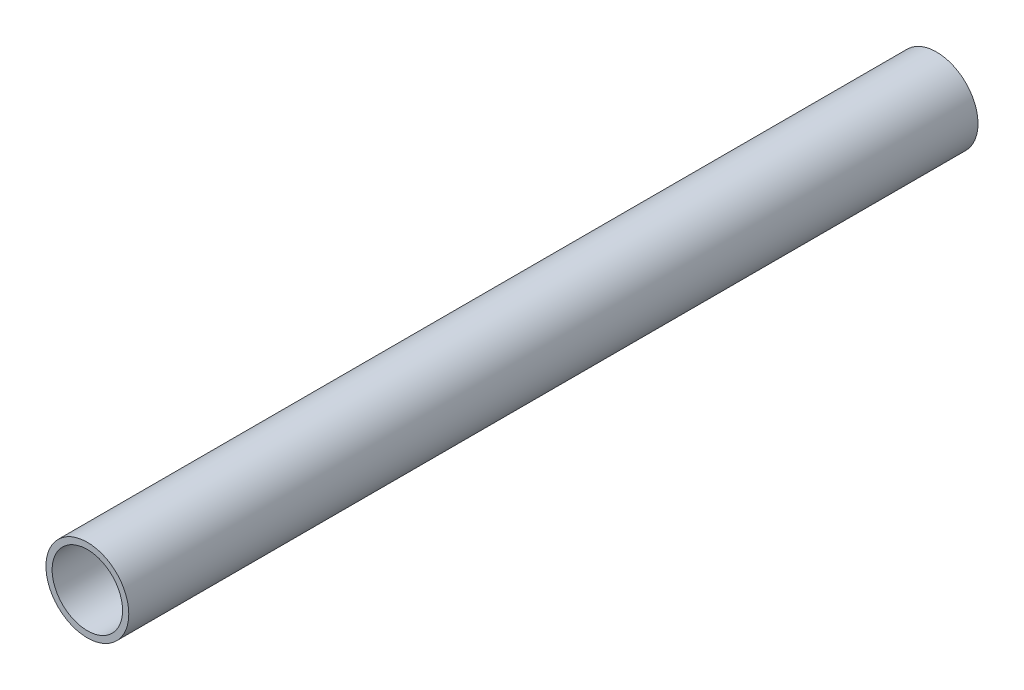
ISO-10303-21;
HEADER;
FILE_DESCRIPTION(('STEP AP214'),'2;1');
FILE_NAME('part.step','',(''),(''),'','','');
FILE_SCHEMA(('AUTOMOTIVE_DESIGN { 1 0 10303 214 1 1 1 1 }'));
ENDSEC;
DATA;
#1=APPLICATION_CONTEXT('core data for automotive mechanical design processes');
#2=APPLICATION_PROTOCOL_DEFINITION('international standard','automotive_design',2000,#1);
#3=PRODUCT_CONTEXT('',#1,'mechanical');
#4=PRODUCT('Part','Part','',(#3));
#5=PRODUCT_RELATED_PRODUCT_CATEGORY('part','',(#4));
#6=PRODUCT_DEFINITION_FORMATION('','',#4);
#7=PRODUCT_DEFINITION_CONTEXT('part definition',#1,'design');
#8=PRODUCT_DEFINITION('design','',#6,#7);
#9=PRODUCT_DEFINITION_SHAPE('','',#8);
#10=(LENGTH_UNIT() NAMED_UNIT(*) SI_UNIT(.MILLI.,.METRE.));
#11=(NAMED_UNIT(*) PLANE_ANGLE_UNIT() SI_UNIT($,.RADIAN.));
#12=(NAMED_UNIT(*) SI_UNIT($,.STERADIAN.) SOLID_ANGLE_UNIT());
#13=UNCERTAINTY_MEASURE_WITH_UNIT(LENGTH_MEASURE(1.E-05),#10,'distance_accuracy_value','');
#14=(GEOMETRIC_REPRESENTATION_CONTEXT(3) GLOBAL_UNCERTAINTY_ASSIGNED_CONTEXT((#13)) GLOBAL_UNIT_ASSIGNED_CONTEXT((#10,
#11,#12)) REPRESENTATION_CONTEXT('',''));
#15=CARTESIAN_POINT('',(0.,0.,0.));
#16=DIRECTION('',(0.,0.,1.));
#17=DIRECTION('',(1.,0.,0.));
#18=AXIS2_PLACEMENT_3D('',#15,#16,#17);
#19=CARTESIAN_POINT('',(0.,0.,-410.));
#20=DIRECTION('',(0.,0.,1.));
#21=DIRECTION('',(1.,0.,0.));
#22=AXIS2_PLACEMENT_3D('',#19,#20,#21);
#23=CYLINDRICAL_SURFACE('',#22,20.);
#24=CARTESIAN_POINT('',(0.,0.,-410.));
#25=DIRECTION('',(0.,0.,1.));
#26=DIRECTION('',(1.,0.,0.));
#27=AXIS2_PLACEMENT_3D('',#24,#25,#26);
#28=CIRCLE('',#27,20.);
#29=CARTESIAN_POINT('',(20.,0.,-410.));
#30=VERTEX_POINT('',#29);
#31=EDGE_CURVE('E10',#30,#30,#28,.T.);
#32=CARTESIAN_POINT('',(0.,0.,0.));
#33=DIRECTION('',(0.,0.,1.));
#34=DIRECTION('',(1.,0.,0.));
#35=AXIS2_PLACEMENT_3D('',#32,#33,#34);
#36=CIRCLE('',#35,20.);
#37=CARTESIAN_POINT('',(20.,0.,0.));
#38=VERTEX_POINT('',#37);
#39=EDGE_CURVE('E37',#38,#38,#36,.T.);
#40=CARTESIAN_POINT('',(20.,0.,-410.));
#41=CARTESIAN_POINT('',(20.,0.,-405.729166666667));
#42=CARTESIAN_POINT('',(20.,0.,-401.458333333333));
#43=CARTESIAN_POINT('',(20.,0.,-392.916666666667));
#44=CARTESIAN_POINT('',(20.,0.,-388.645833333333));
#45=CARTESIAN_POINT('',(20.,0.,-380.104166666667));
#46=CARTESIAN_POINT('',(20.,0.,-375.833333333333));
#47=CARTESIAN_POINT('',(20.,0.,-367.291666666667));
#48=CARTESIAN_POINT('',(20.,0.,-363.020833333333));
#49=CARTESIAN_POINT('',(20.,0.,-354.479166666667));
#50=CARTESIAN_POINT('',(20.,0.,-350.208333333333));
#51=CARTESIAN_POINT('',(20.,0.,-341.666666666667));
#52=CARTESIAN_POINT('',(20.,0.,-337.395833333333));
#53=CARTESIAN_POINT('',(20.,0.,-328.854166666667));
#54=CARTESIAN_POINT('',(20.,0.,-324.583333333333));
#55=CARTESIAN_POINT('',(20.,0.,-316.041666666667));
#56=CARTESIAN_POINT('',(20.,0.,-311.770833333333));
#57=CARTESIAN_POINT('',(20.,0.,-303.229166666667));
#58=CARTESIAN_POINT('',(20.,0.,-298.958333333333));
#59=CARTESIAN_POINT('',(20.,0.,-290.416666666667));
#60=CARTESIAN_POINT('',(20.,0.,-286.145833333333));
#61=CARTESIAN_POINT('',(20.,0.,-277.604166666667));
#62=CARTESIAN_POINT('',(20.,0.,-273.333333333333));
#63=CARTESIAN_POINT('',(20.,0.,-264.791666666667));
#64=CARTESIAN_POINT('',(20.,0.,-260.520833333333));
#65=CARTESIAN_POINT('',(20.,0.,-251.979166666667));
#66=CARTESIAN_POINT('',(20.,0.,-247.708333333333));
#67=CARTESIAN_POINT('',(20.,0.,-239.166666666667));
#68=CARTESIAN_POINT('',(20.,0.,-234.895833333333));
#69=CARTESIAN_POINT('',(20.,0.,-226.354166666667));
#70=CARTESIAN_POINT('',(20.,0.,-222.083333333333));
#71=CARTESIAN_POINT('',(20.,0.,-213.541666666667));
#72=CARTESIAN_POINT('',(20.,0.,-209.270833333333));
#73=CARTESIAN_POINT('',(20.,0.,-200.729166666667));
#74=CARTESIAN_POINT('',(20.,0.,-196.458333333333));
#75=CARTESIAN_POINT('',(20.,0.,-187.916666666667));
#76=CARTESIAN_POINT('',(20.,0.,-183.645833333333));
#77=CARTESIAN_POINT('',(20.,0.,-175.104166666667));
#78=CARTESIAN_POINT('',(20.,0.,-170.833333333333));
#79=CARTESIAN_POINT('',(20.,0.,-162.291666666667));
#80=CARTESIAN_POINT('',(20.,0.,-158.020833333333));
#81=CARTESIAN_POINT('',(20.,0.,-149.479166666667));
#82=CARTESIAN_POINT('',(20.,0.,-145.208333333333));
#83=CARTESIAN_POINT('',(20.,0.,-136.666666666667));
#84=CARTESIAN_POINT('',(20.,0.,-132.395833333333));
#85=CARTESIAN_POINT('',(20.,0.,-123.854166666667));
#86=CARTESIAN_POINT('',(20.,0.,-119.583333333333));
#87=CARTESIAN_POINT('',(20.,0.,-111.041666666667));
#88=CARTESIAN_POINT('',(20.,0.,-106.770833333333));
#89=CARTESIAN_POINT('',(20.,0.,-98.2291666666667));
#90=CARTESIAN_POINT('',(20.,0.,-93.9583333333334));
#91=CARTESIAN_POINT('',(20.,0.,-85.4166666666667));
#92=CARTESIAN_POINT('',(20.,0.,-81.1458333333334));
#93=CARTESIAN_POINT('',(20.,0.,-72.6041666666667));
#94=CARTESIAN_POINT('',(20.,0.,-68.3333333333334));
#95=CARTESIAN_POINT('',(20.,0.,-59.7916666666667));
#96=CARTESIAN_POINT('',(20.,0.,-55.5208333333333));
#97=CARTESIAN_POINT('',(20.,0.,-46.9791666666667));
#98=CARTESIAN_POINT('',(20.,0.,-42.7083333333333));
#99=CARTESIAN_POINT('',(20.,0.,-34.1666666666667));
#100=CARTESIAN_POINT('',(20.,0.,-29.8958333333333));
#101=CARTESIAN_POINT('',(20.,0.,-21.3541666666667));
#102=CARTESIAN_POINT('',(20.,0.,-17.0833333333333));
#103=CARTESIAN_POINT('',(20.,0.,-8.54166666666667));
#104=CARTESIAN_POINT('',(20.,0.,-4.27083333333333));
#105=CARTESIAN_POINT('',(20.,0.,0.));
#106=B_SPLINE_CURVE_WITH_KNOTS('',3,(#40,#41,#42,#43,#44,#45,#46,#47,#48,#49,#50,#51,#52,#53,
#54,#55,#56,#57,#58,#59,#60,#61,#62,#63,#64,#65,#66,#67,#68,#69,#70,#71,#72,#73,#74,#75,#76,#77,
#78,#79,#80,#81,#82,#83,#84,#85,#86,#87,#88,#89,#90,#91,#92,#93,#94,#95,#96,#97,#98,#99,#100,
#101,#102,#103,#104,#105),.UNSPECIFIED.,.F.,.F.,(4,2,2,2,2,2,2,2,2,2,2,2,2,2,2,2,2,2,2,2,2,2,2,
2,2,2,2,2,2,2,2,2,4),(0.,12.8125,25.625,38.4375,51.25,64.0625,76.875,89.6875,102.5,115.3125,
128.125,140.9375,153.75,166.5625,179.375,192.1875,205.,217.8125,230.625,243.4375,256.25,
269.0625,281.875,294.6875,307.5,320.3125,333.125,345.9375,358.75,371.5625,384.375,397.1875,
410.),.UNSPECIFIED.);
#107=EDGE_CURVE('BSEAM40',#30,#38,#106,.T.);
#108=ORIENTED_EDGE('',*,*,#31,.T.);
#109=ORIENTED_EDGE('',*,*,#39,.F.);
#110=ORIENTED_EDGE('',*,*,#107,.T.);
#111=ORIENTED_EDGE('',*,*,#107,.F.);
#112=EDGE_LOOP('',(#108,#110,#109,#111));
#113=FACE_BOUND('',#112,.T.);
#114=ADVANCED_FACE('F40',(#113),#23,.T.);
#115=CARTESIAN_POINT('',(0.,0.,-410.));
#116=DIRECTION('',(0.,0.,1.));
#117=DIRECTION('',(1.,0.,0.));
#118=AXIS2_PLACEMENT_3D('',#115,#116,#117);
#119=PLANE('',#118);
#120=CARTESIAN_POINT('',(0.,0.,-410.));
#121=DIRECTION('',(0.,0.,1.));
#122=DIRECTION('',(1.,0.,0.));
#123=AXIS2_PLACEMENT_3D('',#120,#121,#122);
#124=CIRCLE('',#123,17.);
#125=CARTESIAN_POINT('',(17.,0.,-410.));
#126=VERTEX_POINT('',#125);
#127=EDGE_CURVE('E50',#126,#126,#124,.T.);
#128=ORIENTED_EDGE('',*,*,#127,.T.);
#129=EDGE_LOOP('',(#128));
#130=FACE_BOUND('',#129,.T.);
#131=ORIENTED_EDGE('',*,*,#31,.F.);
#132=EDGE_LOOP('',(#131));
#133=FACE_BOUND('',#132,.T.);
#134=ADVANCED_FACE('F54',(#130,#133),#119,.F.);
#135=CARTESIAN_POINT('',(0.,0.,0.));
#136=DIRECTION('',(0.,0.,1.));
#137=DIRECTION('',(1.,0.,0.));
#138=AXIS2_PLACEMENT_3D('',#135,#136,#137);
#139=PLANE('',#138);
#140=CARTESIAN_POINT('',(0.,0.,0.));
#141=DIRECTION('',(0.,0.,1.));
#142=DIRECTION('',(1.,0.,0.));
#143=AXIS2_PLACEMENT_3D('',#140,#141,#142);
#144=CIRCLE('',#143,17.);
#145=CARTESIAN_POINT('',(17.,0.,0.));
#146=VERTEX_POINT('',#145);
#147=EDGE_CURVE('E47',#146,#146,#144,.T.);
#148=ORIENTED_EDGE('',*,*,#147,.F.);
#149=EDGE_LOOP('',(#148));
#150=FACE_BOUND('',#149,.T.);
#151=ORIENTED_EDGE('',*,*,#39,.T.);
#152=EDGE_LOOP('',(#151));
#153=FACE_BOUND('',#152,.T.);
#154=ADVANCED_FACE('F61',(#150,#153),#139,.T.);
#155=CARTESIAN_POINT('',(0.,0.,-410.));
#156=DIRECTION('',(0.,0.,1.));
#157=DIRECTION('',(1.,0.,0.));
#158=AXIS2_PLACEMENT_3D('',#155,#156,#157);
#159=CYLINDRICAL_SURFACE('',#158,17.);
#160=CARTESIAN_POINT('',(17.,0.,-410.));
#161=CARTESIAN_POINT('',(17.,0.,-405.729166666667));
#162=CARTESIAN_POINT('',(17.,0.,-401.458333333333));
#163=CARTESIAN_POINT('',(17.,0.,-392.916666666667));
#164=CARTESIAN_POINT('',(17.,0.,-388.645833333333));
#165=CARTESIAN_POINT('',(17.,0.,-380.104166666667));
#166=CARTESIAN_POINT('',(17.,0.,-375.833333333333));
#167=CARTESIAN_POINT('',(17.,0.,-367.291666666667));
#168=CARTESIAN_POINT('',(17.,0.,-363.020833333333));
#169=CARTESIAN_POINT('',(17.,0.,-354.479166666667));
#170=CARTESIAN_POINT('',(17.,0.,-350.208333333333));
#171=CARTESIAN_POINT('',(17.,0.,-341.666666666667));
#172=CARTESIAN_POINT('',(17.,0.,-337.395833333333));
#173=CARTESIAN_POINT('',(17.,0.,-328.854166666667));
#174=CARTESIAN_POINT('',(17.,0.,-324.583333333333));
#175=CARTESIAN_POINT('',(17.,0.,-316.041666666667));
#176=CARTESIAN_POINT('',(17.,0.,-311.770833333333));
#177=CARTESIAN_POINT('',(17.,0.,-303.229166666667));
#178=CARTESIAN_POINT('',(17.,0.,-298.958333333333));
#179=CARTESIAN_POINT('',(17.,0.,-290.416666666667));
#180=CARTESIAN_POINT('',(17.,0.,-286.145833333333));
#181=CARTESIAN_POINT('',(17.,0.,-277.604166666667));
#182=CARTESIAN_POINT('',(17.,0.,-273.333333333333));
#183=CARTESIAN_POINT('',(17.,0.,-264.791666666667));
#184=CARTESIAN_POINT('',(17.,0.,-260.520833333333));
#185=CARTESIAN_POINT('',(17.,0.,-251.979166666667));
#186=CARTESIAN_POINT('',(17.,0.,-247.708333333333));
#187=CARTESIAN_POINT('',(17.,0.,-239.166666666667));
#188=CARTESIAN_POINT('',(17.,0.,-234.895833333333));
#189=CARTESIAN_POINT('',(17.,0.,-226.354166666667));
#190=CARTESIAN_POINT('',(17.,0.,-222.083333333333));
#191=CARTESIAN_POINT('',(17.,0.,-213.541666666667));
#192=CARTESIAN_POINT('',(17.,0.,-209.270833333333));
#193=CARTESIAN_POINT('',(17.,0.,-200.729166666667));
#194=CARTESIAN_POINT('',(17.,0.,-196.458333333333));
#195=CARTESIAN_POINT('',(17.,0.,-187.916666666667));
#196=CARTESIAN_POINT('',(17.,0.,-183.645833333333));
#197=CARTESIAN_POINT('',(17.,0.,-175.104166666667));
#198=CARTESIAN_POINT('',(17.,0.,-170.833333333333));
#199=CARTESIAN_POINT('',(17.,0.,-162.291666666667));
#200=CARTESIAN_POINT('',(17.,0.,-158.020833333333));
#201=CARTESIAN_POINT('',(17.,0.,-149.479166666667));
#202=CARTESIAN_POINT('',(17.,0.,-145.208333333333));
#203=CARTESIAN_POINT('',(17.,0.,-136.666666666667));
#204=CARTESIAN_POINT('',(17.,0.,-132.395833333333));
#205=CARTESIAN_POINT('',(17.,0.,-123.854166666667));
#206=CARTESIAN_POINT('',(17.,0.,-119.583333333333));
#207=CARTESIAN_POINT('',(17.,0.,-111.041666666667));
#208=CARTESIAN_POINT('',(17.,0.,-106.770833333333));
#209=CARTESIAN_POINT('',(17.,0.,-98.2291666666667));
#210=CARTESIAN_POINT('',(17.,0.,-93.9583333333334));
#211=CARTESIAN_POINT('',(17.,0.,-85.4166666666667));
#212=CARTESIAN_POINT('',(17.,0.,-81.1458333333334));
#213=CARTESIAN_POINT('',(17.,0.,-72.6041666666667));
#214=CARTESIAN_POINT('',(17.,0.,-68.3333333333334));
#215=CARTESIAN_POINT('',(17.,0.,-59.7916666666667));
#216=CARTESIAN_POINT('',(17.,0.,-55.5208333333333));
#217=CARTESIAN_POINT('',(17.,0.,-46.9791666666667));
#218=CARTESIAN_POINT('',(17.,0.,-42.7083333333333));
#219=CARTESIAN_POINT('',(17.,0.,-34.1666666666667));
#220=CARTESIAN_POINT('',(17.,0.,-29.8958333333333));
#221=CARTESIAN_POINT('',(17.,0.,-21.3541666666667));
#222=CARTESIAN_POINT('',(17.,0.,-17.0833333333333));
#223=CARTESIAN_POINT('',(17.,0.,-8.54166666666667));
#224=CARTESIAN_POINT('',(17.,0.,-4.27083333333333));
#225=CARTESIAN_POINT('',(17.,0.,0.));
#226=B_SPLINE_CURVE_WITH_KNOTS('',3,(#160,#161,#162,#163,#164,#165,#166,#167,#168,#169,#170,
#171,#172,#173,#174,#175,#176,#177,#178,#179,#180,#181,#182,#183,#184,#185,#186,#187,#188,#189,
#190,#191,#192,#193,#194,#195,#196,#197,#198,#199,#200,#201,#202,#203,#204,#205,#206,#207,#208,
#209,#210,#211,#212,#213,#214,#215,#216,#217,#218,#219,#220,#221,#222,#223,#224,#225),
.UNSPECIFIED.,.F.,.F.,(4,2,2,2,2,2,2,2,2,2,2,2,2,2,2,2,2,2,2,2,2,2,2,2,2,2,2,2,2,2,2,2,4),(0.,
12.8125,25.625,38.4375,51.25,64.0625,76.875,89.6875,102.5,115.3125,128.125,140.9375,153.75,
166.5625,179.375,192.1875,205.,217.8125,230.625,243.4375,256.25,269.0625,281.875,294.6875,307.5,
320.3125,333.125,345.9375,358.75,371.5625,384.375,397.1875,410.),.UNSPECIFIED.);
#227=EDGE_CURVE('BSEAM59',#126,#146,#226,.T.);
#228=ORIENTED_EDGE('',*,*,#127,.F.);
#229=ORIENTED_EDGE('',*,*,#147,.T.);
#230=ORIENTED_EDGE('',*,*,#227,.T.);
#231=ORIENTED_EDGE('',*,*,#227,.F.);
#232=EDGE_LOOP('',(#228,#230,#229,#231));
#233=FACE_BOUND('',#232,.T.);
#234=ADVANCED_FACE('F59',(#233),#159,.F.);
#235=CLOSED_SHELL('',(#114,#134,#154,#234));
#236=MANIFOLD_SOLID_BREP('B2',#235);
#237=ADVANCED_BREP_SHAPE_REPRESENTATION('',(#18,#236),#14);
#238=SHAPE_DEFINITION_REPRESENTATION(#9,#237);
ENDSEC;
END-ISO-10303-21;
